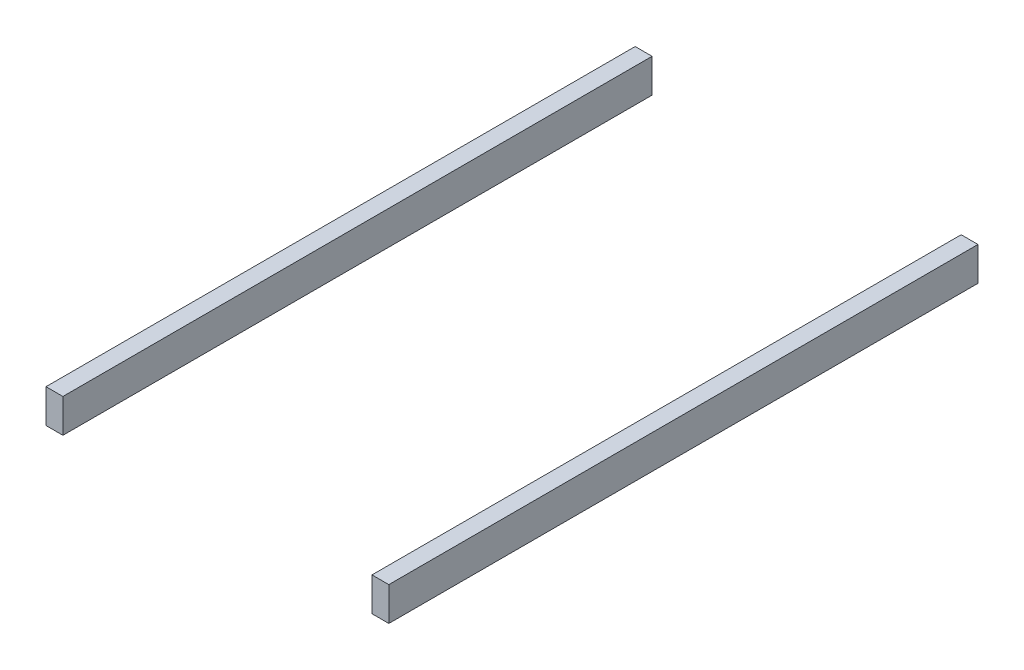
ISO-10303-21;
HEADER;
FILE_DESCRIPTION(('STEP AP214'),'2;1');
FILE_NAME('part.step','',(''),(''),'','','');
FILE_SCHEMA(('AUTOMOTIVE_DESIGN { 1 0 10303 214 1 1 1 1 }'));
ENDSEC;
DATA;
#1=APPLICATION_CONTEXT('core data for automotive mechanical design processes');
#2=APPLICATION_PROTOCOL_DEFINITION('international standard','automotive_design',2000,#1);
#3=PRODUCT_CONTEXT('',#1,'mechanical');
#4=PRODUCT('Part','Part','',(#3));
#5=PRODUCT_RELATED_PRODUCT_CATEGORY('part','',(#4));
#6=PRODUCT_DEFINITION_FORMATION('','',#4);
#7=PRODUCT_DEFINITION_CONTEXT('part definition',#1,'design');
#8=PRODUCT_DEFINITION('design','',#6,#7);
#9=PRODUCT_DEFINITION_SHAPE('','',#8);
#10=(LENGTH_UNIT() NAMED_UNIT(*) SI_UNIT(.MILLI.,.METRE.));
#11=(NAMED_UNIT(*) PLANE_ANGLE_UNIT() SI_UNIT($,.RADIAN.));
#12=(NAMED_UNIT(*) SI_UNIT($,.STERADIAN.) SOLID_ANGLE_UNIT());
#13=UNCERTAINTY_MEASURE_WITH_UNIT(LENGTH_MEASURE(1.E-05),#10,'distance_accuracy_value','');
#14=(GEOMETRIC_REPRESENTATION_CONTEXT(3) GLOBAL_UNCERTAINTY_ASSIGNED_CONTEXT((#13)) GLOBAL_UNIT_ASSIGNED_CONTEXT((#10,
#11,#12)) REPRESENTATION_CONTEXT('',''));
#15=CARTESIAN_POINT('',(0.,0.,0.));
#16=DIRECTION('',(0.,0.,1.));
#17=DIRECTION('',(1.,0.,0.));
#18=AXIS2_PLACEMENT_3D('',#15,#16,#17);
#19=CARTESIAN_POINT('',(1900.94495924813,39.6672890561691,3500.));
#20=DIRECTION('',(1.,0.,0.));
#21=DIRECTION('',(0.,0.,-1.));
#22=AXIS2_PLACEMENT_3D('',#19,#20,#21);
#23=PLANE('',#22);
#24=DIRECTION('',(0.,-1.,0.));
#25=VECTOR('',#24,1.);
#26=CARTESIAN_POINT('',(1900.94495924813,39.6672890561691,0.));
#27=LINE('',#26,#25);
#28=CARTESIAN_POINT('',(1900.94495924813,39.6672890561691,0.));
#29=VERTEX_POINT('',#28);
#30=CARTESIAN_POINT('',(1900.94495924813,-160.332710943831,0.));
#31=VERTEX_POINT('',#30);
#32=EDGE_CURVE('E106',#29,#31,#27,.T.);
#33=ORIENTED_EDGE('',*,*,#32,.T.);
#34=DIRECTION('',(0.,0.,-1.));
#35=VECTOR('',#34,1.);
#36=CARTESIAN_POINT('',(1900.94495924813,-160.332710943831,3500.));
#37=LINE('',#36,#35);
#38=CARTESIAN_POINT('',(1900.94495924813,-160.332710943831,3500.));
#39=VERTEX_POINT('',#38);
#40=EDGE_CURVE('E12',#39,#31,#37,.T.);
#41=ORIENTED_EDGE('',*,*,#40,.F.);
#42=DIRECTION('',(0.,-1.,0.));
#43=VECTOR('',#42,1.);
#44=CARTESIAN_POINT('',(1900.94495924813,39.6672890561691,3500.));
#45=LINE('',#44,#43);
#46=CARTESIAN_POINT('',(1900.94495924813,39.6672890561691,3500.));
#47=VERTEX_POINT('',#46);
#48=EDGE_CURVE('E94',#47,#39,#45,.T.);
#49=ORIENTED_EDGE('',*,*,#48,.F.);
#50=DIRECTION('',(0.,0.,-1.));
#51=VECTOR('',#50,1.);
#52=CARTESIAN_POINT('',(1900.94495924813,39.6672890561691,3500.));
#53=LINE('',#52,#51);
#54=EDGE_CURVE('E102',#47,#29,#53,.T.);
#55=ORIENTED_EDGE('',*,*,#54,.T.);
#56=EDGE_LOOP('',(#33,#41,#49,#55));
#57=FACE_BOUND('',#56,.T.);
#58=ADVANCED_FACE('F43',(#57),#23,.F.);
#59=CARTESIAN_POINT('',(1900.94495924813,-160.332710943831,3500.));
#60=DIRECTION('',(0.,1.,0.));
#61=DIRECTION('',(0.,0.,1.));
#62=AXIS2_PLACEMENT_3D('',#59,#60,#61);
#63=PLANE('',#62);
#64=DIRECTION('',(1.,0.,0.));
#65=VECTOR('',#64,1.);
#66=CARTESIAN_POINT('',(1900.94495924813,-160.332710943831,0.));
#67=LINE('',#66,#65);
#68=CARTESIAN_POINT('',(2000.94495924812,-160.332710943831,0.));
#69=VERTEX_POINT('',#68);
#70=EDGE_CURVE('E98',#31,#69,#67,.T.);
#71=ORIENTED_EDGE('',*,*,#70,.T.);
#72=DIRECTION('',(0.,0.,-1.));
#73=VECTOR('',#72,1.);
#74=CARTESIAN_POINT('',(2000.94495924812,-160.332710943831,3500.));
#75=LINE('',#74,#73);
#76=CARTESIAN_POINT('',(2000.94495924812,-160.332710943831,3500.));
#77=VERTEX_POINT('',#76);
#78=EDGE_CURVE('E51',#77,#69,#75,.T.);
#79=ORIENTED_EDGE('',*,*,#78,.F.);
#80=DIRECTION('',(1.,0.,0.));
#81=VECTOR('',#80,1.);
#82=CARTESIAN_POINT('',(1900.94495924813,-160.332710943831,3500.));
#83=LINE('',#82,#81);
#84=EDGE_CURVE('E89',#39,#77,#83,.T.);
#85=ORIENTED_EDGE('',*,*,#84,.F.);
#86=ORIENTED_EDGE('',*,*,#40,.T.);
#87=EDGE_LOOP('',(#71,#79,#85,#86));
#88=FACE_BOUND('',#87,.T.);
#89=ADVANCED_FACE('F97',(#88),#63,.F.);
#90=CARTESIAN_POINT('',(2000.94495924812,39.6672890561691,3500.));
#91=DIRECTION('',(-1.,0.,0.));
#92=DIRECTION('',(0.,0.,1.));
#93=AXIS2_PLACEMENT_3D('',#90,#91,#92);
#94=PLANE('',#93);
#95=DIRECTION('',(0.,1.,0.));
#96=VECTOR('',#95,1.);
#97=CARTESIAN_POINT('',(2000.94495924812,39.6672890561691,0.));
#98=LINE('',#97,#96);
#99=CARTESIAN_POINT('',(2000.94495924812,39.6672890561691,0.));
#100=VERTEX_POINT('',#99);
#101=EDGE_CURVE('E76',#69,#100,#98,.T.);
#102=ORIENTED_EDGE('',*,*,#101,.T.);
#103=DIRECTION('',(0.,0.,-1.));
#104=VECTOR('',#103,1.);
#105=CARTESIAN_POINT('',(2000.94495924812,39.6672890561691,3500.));
#106=LINE('',#105,#104);
#107=CARTESIAN_POINT('',(2000.94495924812,39.6672890561691,3500.));
#108=VERTEX_POINT('',#107);
#109=EDGE_CURVE('E99',#108,#100,#106,.T.);
#110=ORIENTED_EDGE('',*,*,#109,.F.);
#111=DIRECTION('',(0.,1.,0.));
#112=VECTOR('',#111,1.);
#113=CARTESIAN_POINT('',(2000.94495924812,39.6672890561691,3500.));
#114=LINE('',#113,#112);
#115=EDGE_CURVE('E92',#77,#108,#114,.T.);
#116=ORIENTED_EDGE('',*,*,#115,.F.);
#117=ORIENTED_EDGE('',*,*,#78,.T.);
#118=EDGE_LOOP('',(#102,#110,#116,#117));
#119=FACE_BOUND('',#118,.T.);
#120=ADVANCED_FACE('F100',(#119),#94,.F.);
#121=CARTESIAN_POINT('',(1900.94495924813,39.6672890561691,3500.));
#122=DIRECTION('',(0.,-1.,0.));
#123=DIRECTION('',(1.,0.,0.));
#124=AXIS2_PLACEMENT_3D('',#121,#122,#123);
#125=PLANE('',#124);
#126=DIRECTION('',(-1.,0.,0.));
#127=VECTOR('',#126,1.);
#128=CARTESIAN_POINT('',(1900.94495924813,39.6672890561691,0.));
#129=LINE('',#128,#127);
#130=EDGE_CURVE('E82',#100,#29,#129,.T.);
#131=ORIENTED_EDGE('',*,*,#130,.T.);
#132=ORIENTED_EDGE('',*,*,#54,.F.);
#133=DIRECTION('',(-1.,0.,0.));
#134=VECTOR('',#133,1.);
#135=CARTESIAN_POINT('',(1900.94495924813,39.6672890561691,3500.));
#136=LINE('',#135,#134);
#137=EDGE_CURVE('E59',#108,#47,#136,.T.);
#138=ORIENTED_EDGE('',*,*,#137,.F.);
#139=ORIENTED_EDGE('',*,*,#109,.T.);
#140=EDGE_LOOP('',(#131,#132,#138,#139));
#141=FACE_BOUND('',#140,.T.);
#142=ADVANCED_FACE('F113',(#141),#125,.F.);
#143=CARTESIAN_POINT('',(1900.94495924813,-160.332710943831,3500.));
#144=DIRECTION('',(0.,0.,1.));
#145=DIRECTION('',(1.,0.,0.));
#146=AXIS2_PLACEMENT_3D('',#143,#144,#145);
#147=PLANE('',#146);
#148=ORIENTED_EDGE('',*,*,#48,.T.);
#149=ORIENTED_EDGE('',*,*,#84,.T.);
#150=ORIENTED_EDGE('',*,*,#115,.T.);
#151=ORIENTED_EDGE('',*,*,#137,.T.);
#152=EDGE_LOOP('',(#148,#149,#150,#151));
#153=FACE_BOUND('',#152,.T.);
#154=ADVANCED_FACE('F90',(#153),#147,.T.);
#155=CARTESIAN_POINT('',(1900.94495924813,-160.332710943831,0.));
#156=DIRECTION('',(0.,0.,1.));
#157=DIRECTION('',(1.,0.,0.));
#158=AXIS2_PLACEMENT_3D('',#155,#156,#157);
#159=PLANE('',#158);
#160=ORIENTED_EDGE('',*,*,#32,.F.);
#161=ORIENTED_EDGE('',*,*,#130,.F.);
#162=ORIENTED_EDGE('',*,*,#101,.F.);
#163=ORIENTED_EDGE('',*,*,#70,.F.);
#164=EDGE_LOOP('',(#160,#161,#162,#163));
#165=FACE_BOUND('',#164,.T.);
#166=ADVANCED_FACE('F116',(#165),#159,.F.);
#167=CLOSED_SHELL('',(#58,#89,#120,#142,#154,#166));
#168=MANIFOLD_SOLID_BREP('B2',#167);
#169=CARTESIAN_POINT('',(-35.5637763951861,39.6672890561691,3500.));
#170=DIRECTION('',(1.,0.,0.));
#171=DIRECTION('',(0.,0.,-1.));
#172=AXIS2_PLACEMENT_3D('',#169,#170,#171);
#173=PLANE('',#172);
#174=DIRECTION('',(0.,-1.,0.));
#175=VECTOR('',#174,1.);
#176=CARTESIAN_POINT('',(-35.5637763951861,39.6672890561691,0.));
#177=LINE('',#176,#175);
#178=CARTESIAN_POINT('',(-35.5637763951861,39.6672890561691,0.));
#179=VERTEX_POINT('',#178);
#180=CARTESIAN_POINT('',(-35.5637763951861,-160.332710943831,0.));
#181=VERTEX_POINT('',#180);
#182=EDGE_CURVE('E230',#179,#181,#177,.T.);
#183=ORIENTED_EDGE('',*,*,#182,.T.);
#184=DIRECTION('',(0.,0.,-1.));
#185=VECTOR('',#184,1.);
#186=CARTESIAN_POINT('',(-35.5637763951861,-160.332710943831,3500.));
#187=LINE('',#186,#185);
#188=CARTESIAN_POINT('',(-35.5637763951861,-160.332710943831,3500.));
#189=VERTEX_POINT('',#188);
#190=EDGE_CURVE('E41',#189,#181,#187,.T.);
#191=ORIENTED_EDGE('',*,*,#190,.F.);
#192=DIRECTION('',(0.,-1.,0.));
#193=VECTOR('',#192,1.);
#194=CARTESIAN_POINT('',(-35.5637763951861,39.6672890561691,3500.));
#195=LINE('',#194,#193);
#196=CARTESIAN_POINT('',(-35.5637763951861,39.6672890561691,3500.));
#197=VERTEX_POINT('',#196);
#198=EDGE_CURVE('E218',#197,#189,#195,.T.);
#199=ORIENTED_EDGE('',*,*,#198,.F.);
#200=DIRECTION('',(0.,0.,-1.));
#201=VECTOR('',#200,1.);
#202=CARTESIAN_POINT('',(-35.5637763951861,39.6672890561691,3500.));
#203=LINE('',#202,#201);
#204=EDGE_CURVE('E226',#197,#179,#203,.T.);
#205=ORIENTED_EDGE('',*,*,#204,.T.);
#206=EDGE_LOOP('',(#183,#191,#199,#205));
#207=FACE_BOUND('',#206,.T.);
#208=ADVANCED_FACE('F167',(#207),#173,.F.);
#209=CARTESIAN_POINT('',(-35.5637763951861,-160.332710943831,3500.));
#210=DIRECTION('',(0.,1.,0.));
#211=DIRECTION('',(0.,0.,1.));
#212=AXIS2_PLACEMENT_3D('',#209,#210,#211);
#213=PLANE('',#212);
#214=DIRECTION('',(1.,0.,0.));
#215=VECTOR('',#214,1.);
#216=CARTESIAN_POINT('',(-35.5637763951861,-160.332710943831,0.));
#217=LINE('',#216,#215);
#218=CARTESIAN_POINT('',(64.9449592481257,-160.332710943831,0.));
#219=VERTEX_POINT('',#218);
#220=EDGE_CURVE('E222',#181,#219,#217,.T.);
#221=ORIENTED_EDGE('',*,*,#220,.T.);
#222=DIRECTION('',(0.,0.,-1.));
#223=VECTOR('',#222,1.);
#224=CARTESIAN_POINT('',(64.9449592481257,-160.332710943831,3500.));
#225=LINE('',#224,#223);
#226=CARTESIAN_POINT('',(64.9449592481257,-160.332710943831,3500.));
#227=VERTEX_POINT('',#226);
#228=EDGE_CURVE('E175',#227,#219,#225,.T.);
#229=ORIENTED_EDGE('',*,*,#228,.F.);
#230=DIRECTION('',(1.,0.,0.));
#231=VECTOR('',#230,1.);
#232=CARTESIAN_POINT('',(-35.5637763951861,-160.332710943831,3500.));
#233=LINE('',#232,#231);
#234=EDGE_CURVE('E213',#189,#227,#233,.T.);
#235=ORIENTED_EDGE('',*,*,#234,.F.);
#236=ORIENTED_EDGE('',*,*,#190,.T.);
#237=EDGE_LOOP('',(#221,#229,#235,#236));
#238=FACE_BOUND('',#237,.T.);
#239=ADVANCED_FACE('F221',(#238),#213,.F.);
#240=CARTESIAN_POINT('',(64.9449592481257,39.6672890561691,3500.));
#241=DIRECTION('',(-1.,0.,0.));
#242=DIRECTION('',(0.,-1.,0.));
#243=AXIS2_PLACEMENT_3D('',#240,#241,#242);
#244=PLANE('',#243);
#245=DIRECTION('',(0.,1.,0.));
#246=VECTOR('',#245,1.);
#247=CARTESIAN_POINT('',(64.9449592481257,39.6672890561691,0.));
#248=LINE('',#247,#246);
#249=CARTESIAN_POINT('',(64.9449592481257,39.6672890561691,0.));
#250=VERTEX_POINT('',#249);
#251=EDGE_CURVE('E200',#219,#250,#248,.T.);
#252=ORIENTED_EDGE('',*,*,#251,.T.);
#253=DIRECTION('',(0.,0.,-1.));
#254=VECTOR('',#253,1.);
#255=CARTESIAN_POINT('',(64.9449592481257,39.6672890561691,3500.));
#256=LINE('',#255,#254);
#257=CARTESIAN_POINT('',(64.9449592481257,39.6672890561691,3500.));
#258=VERTEX_POINT('',#257);
#259=EDGE_CURVE('E223',#258,#250,#256,.T.);
#260=ORIENTED_EDGE('',*,*,#259,.F.);
#261=DIRECTION('',(0.,1.,0.));
#262=VECTOR('',#261,1.);
#263=CARTESIAN_POINT('',(64.9449592481257,39.6672890561691,3500.));
#264=LINE('',#263,#262);
#265=EDGE_CURVE('E216',#227,#258,#264,.T.);
#266=ORIENTED_EDGE('',*,*,#265,.F.);
#267=ORIENTED_EDGE('',*,*,#228,.T.);
#268=EDGE_LOOP('',(#252,#260,#266,#267));
#269=FACE_BOUND('',#268,.T.);
#270=ADVANCED_FACE('F224',(#269),#244,.F.);
#271=CARTESIAN_POINT('',(-35.5637763951861,39.6672890561691,3500.));
#272=DIRECTION('',(0.,-1.,0.));
#273=DIRECTION('',(0.,0.,-1.));
#274=AXIS2_PLACEMENT_3D('',#271,#272,#273);
#275=PLANE('',#274);
#276=DIRECTION('',(-1.,0.,0.));
#277=VECTOR('',#276,1.);
#278=CARTESIAN_POINT('',(-35.5637763951861,39.6672890561691,0.));
#279=LINE('',#278,#277);
#280=EDGE_CURVE('E206',#250,#179,#279,.T.);
#281=ORIENTED_EDGE('',*,*,#280,.T.);
#282=ORIENTED_EDGE('',*,*,#204,.F.);
#283=DIRECTION('',(-1.,0.,0.));
#284=VECTOR('',#283,1.);
#285=CARTESIAN_POINT('',(-35.5637763951861,39.6672890561691,3500.));
#286=LINE('',#285,#284);
#287=EDGE_CURVE('E183',#258,#197,#286,.T.);
#288=ORIENTED_EDGE('',*,*,#287,.F.);
#289=ORIENTED_EDGE('',*,*,#259,.T.);
#290=EDGE_LOOP('',(#281,#282,#288,#289));
#291=FACE_BOUND('',#290,.T.);
#292=ADVANCED_FACE('F237',(#291),#275,.F.);
#293=CARTESIAN_POINT('',(-35.5637763951861,-160.332710943831,3500.));
#294=DIRECTION('',(0.,0.,1.));
#295=DIRECTION('',(1.,0.,0.));
#296=AXIS2_PLACEMENT_3D('',#293,#294,#295);
#297=PLANE('',#296);
#298=ORIENTED_EDGE('',*,*,#198,.T.);
#299=ORIENTED_EDGE('',*,*,#234,.T.);
#300=ORIENTED_EDGE('',*,*,#265,.T.);
#301=ORIENTED_EDGE('',*,*,#287,.T.);
#302=EDGE_LOOP('',(#298,#299,#300,#301));
#303=FACE_BOUND('',#302,.T.);
#304=ADVANCED_FACE('F214',(#303),#297,.T.);
#305=CARTESIAN_POINT('',(-35.5637763951861,-160.332710943831,0.));
#306=DIRECTION('',(0.,0.,1.));
#307=DIRECTION('',(1.,0.,0.));
#308=AXIS2_PLACEMENT_3D('',#305,#306,#307);
#309=PLANE('',#308);
#310=ORIENTED_EDGE('',*,*,#182,.F.);
#311=ORIENTED_EDGE('',*,*,#280,.F.);
#312=ORIENTED_EDGE('',*,*,#251,.F.);
#313=ORIENTED_EDGE('',*,*,#220,.F.);
#314=EDGE_LOOP('',(#310,#311,#312,#313));
#315=FACE_BOUND('',#314,.T.);
#316=ADVANCED_FACE('F240',(#315),#309,.F.);
#317=CLOSED_SHELL('',(#208,#239,#270,#292,#304,#316));
#318=MANIFOLD_SOLID_BREP('B6',#317);
#319=ADVANCED_BREP_SHAPE_REPRESENTATION('',(#18,#168,#318),#14);
#320=SHAPE_DEFINITION_REPRESENTATION(#9,#319);
ENDSEC;
END-ISO-10303-21;
